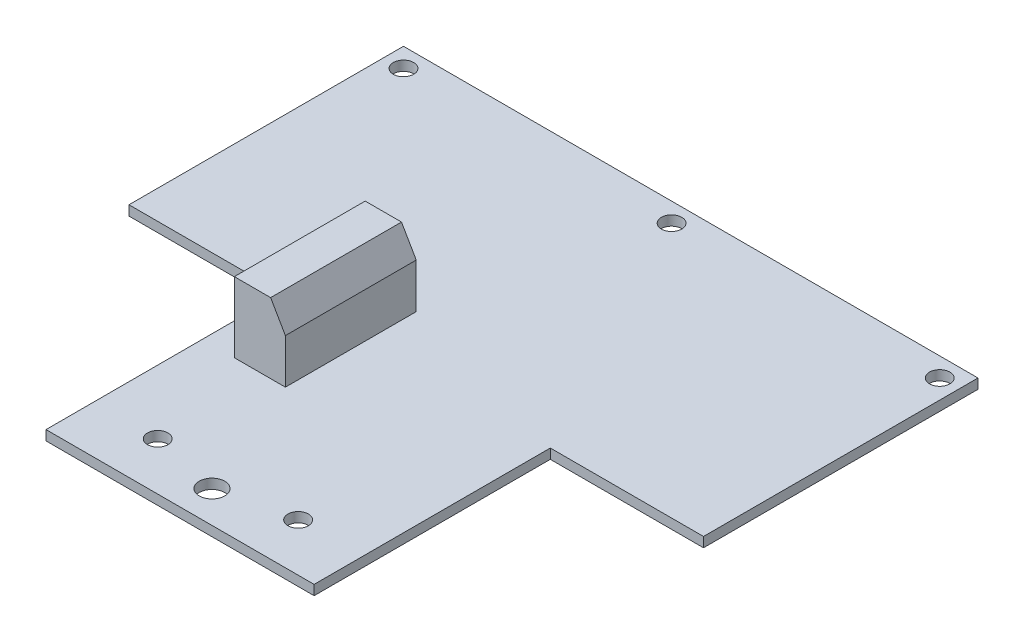
ISO-10303-21;
HEADER;
FILE_DESCRIPTION(('STEP AP214'),'2;1');
FILE_NAME('part.step','',(''),(''),'','','');
FILE_SCHEMA(('AUTOMOTIVE_DESIGN { 1 0 10303 214 1 1 1 1 }'));
ENDSEC;
DATA;
#1=APPLICATION_CONTEXT('core data for automotive mechanical design processes');
#2=APPLICATION_PROTOCOL_DEFINITION('international standard','automotive_design',2000,#1);
#3=PRODUCT_CONTEXT('',#1,'mechanical');
#4=PRODUCT('Part','Part','',(#3));
#5=PRODUCT_RELATED_PRODUCT_CATEGORY('part','',(#4));
#6=PRODUCT_DEFINITION_FORMATION('','',#4);
#7=PRODUCT_DEFINITION_CONTEXT('part definition',#1,'design');
#8=PRODUCT_DEFINITION('design','',#6,#7);
#9=PRODUCT_DEFINITION_SHAPE('','',#8);
#10=(LENGTH_UNIT() NAMED_UNIT(*) SI_UNIT(.MILLI.,.METRE.));
#11=(NAMED_UNIT(*) PLANE_ANGLE_UNIT() SI_UNIT($,.RADIAN.));
#12=(NAMED_UNIT(*) SI_UNIT($,.STERADIAN.) SOLID_ANGLE_UNIT());
#13=UNCERTAINTY_MEASURE_WITH_UNIT(LENGTH_MEASURE(1.E-05),#10,'distance_accuracy_value','');
#14=(GEOMETRIC_REPRESENTATION_CONTEXT(3) GLOBAL_UNCERTAINTY_ASSIGNED_CONTEXT((#13)) GLOBAL_UNIT_ASSIGNED_CONTEXT((#10,
#11,#12)) REPRESENTATION_CONTEXT('',''));
#15=CARTESIAN_POINT('',(0.,0.,0.));
#16=DIRECTION('',(0.,0.,1.));
#17=DIRECTION('',(1.,0.,0.));
#18=AXIS2_PLACEMENT_3D('',#15,#16,#17);
#19=CARTESIAN_POINT('',(0.,1.54,0.));
#20=DIRECTION('',(0.,1.,0.));
#21=DIRECTION('',(0.,0.,1.));
#22=AXIS2_PLACEMENT_3D('',#19,#20,#21);
#23=PLANE('',#22);
#24=CARTESIAN_POINT('',(-11.,1.54,-7.5));
#25=DIRECTION('',(0.,1.,0.));
#26=DIRECTION('',(0.,0.,-1.));
#27=AXIS2_PLACEMENT_3D('',#24,#25,#26);
#28=CIRCLE('',#27,1.6);
#29=CARTESIAN_POINT('',(-11.,1.54,-9.1));
#30=VERTEX_POINT('',#29);
#31=EDGE_CURVE('E157',#30,#30,#28,.T.);
#32=ORIENTED_EDGE('',*,*,#31,.F.);
#33=EDGE_LOOP('',(#32));
#34=FACE_BOUND('',#33,.T.);
#35=CARTESIAN_POINT('',(0.,1.54,-5.));
#36=DIRECTION('',(0.,1.,0.));
#37=DIRECTION('',(0.,0.,1.));
#38=AXIS2_PLACEMENT_3D('',#35,#36,#37);
#39=CIRCLE('',#38,2.);
#40=CARTESIAN_POINT('',(0.,1.54,-3.));
#41=VERTEX_POINT('',#40);
#42=EDGE_CURVE('E172',#41,#41,#39,.T.);
#43=ORIENTED_EDGE('',*,*,#42,.F.);
#44=EDGE_LOOP('',(#43));
#45=FACE_BOUND('',#44,.T.);
#46=CARTESIAN_POINT('',(42.,1.54,-77.));
#47=DIRECTION('',(0.,1.,0.));
#48=DIRECTION('',(0.,0.,1.));
#49=AXIS2_PLACEMENT_3D('',#46,#47,#48);
#50=CIRCLE('',#49,1.6);
#51=CARTESIAN_POINT('',(42.,1.54,-75.4));
#52=VERTEX_POINT('',#51);
#53=EDGE_CURVE('E184',#52,#52,#50,.T.);
#54=ORIENTED_EDGE('',*,*,#53,.F.);
#55=EDGE_LOOP('',(#54));
#56=FACE_BOUND('',#55,.T.);
#57=DIRECTION('',(1.,0.,0.));
#58=VECTOR('',#57,1.);
#59=CARTESIAN_POINT('',(21.,1.54,-37.));
#60=LINE('',#59,#58);
#61=CARTESIAN_POINT('',(21.,1.54,-37.));
#62=VERTEX_POINT('',#61);
#63=CARTESIAN_POINT('',(45.,1.54,-37.));
#64=VERTEX_POINT('',#63);
#65=EDGE_CURVE('E196',#62,#64,#60,.T.);
#66=ORIENTED_EDGE('',*,*,#65,.T.);
#67=DIRECTION('',(0.,0.,-1.));
#68=VECTOR('',#67,1.);
#69=CARTESIAN_POINT('',(45.,1.54,-37.));
#70=LINE('',#69,#68);
#71=CARTESIAN_POINT('',(45.,1.54,-80.));
#72=VERTEX_POINT('',#71);
#73=EDGE_CURVE('E199',#64,#72,#70,.T.);
#74=ORIENTED_EDGE('',*,*,#73,.T.);
#75=DIRECTION('',(-1.,0.,0.));
#76=VECTOR('',#75,1.);
#77=CARTESIAN_POINT('',(45.,1.54,-80.));
#78=LINE('',#77,#76);
#79=CARTESIAN_POINT('',(-45.,1.54,-80.));
#80=VERTEX_POINT('',#79);
#81=EDGE_CURVE('E202',#72,#80,#78,.T.);
#82=ORIENTED_EDGE('',*,*,#81,.T.);
#83=DIRECTION('',(0.,0.,1.));
#84=VECTOR('',#83,1.);
#85=CARTESIAN_POINT('',(-45.,1.54,-37.));
#86=LINE('',#85,#84);
#87=CARTESIAN_POINT('',(-45.,1.54,-37.));
#88=VERTEX_POINT('',#87);
#89=EDGE_CURVE('E204',#80,#88,#86,.T.);
#90=ORIENTED_EDGE('',*,*,#89,.T.);
#91=DIRECTION('',(1.,0.,0.));
#92=VECTOR('',#91,1.);
#93=CARTESIAN_POINT('',(-21.,1.54,-37.));
#94=LINE('',#93,#92);
#95=CARTESIAN_POINT('',(-21.,1.54,-37.));
#96=VERTEX_POINT('',#95);
#97=EDGE_CURVE('E206',#88,#96,#94,.T.);
#98=ORIENTED_EDGE('',*,*,#97,.T.);
#99=DIRECTION('',(0.,0.,1.));
#100=VECTOR('',#99,1.);
#101=CARTESIAN_POINT('',(-21.,1.54,0.));
#102=LINE('',#101,#100);
#103=CARTESIAN_POINT('',(-21.,1.54,0.));
#104=VERTEX_POINT('',#103);
#105=EDGE_CURVE('E208',#96,#104,#102,.T.);
#106=ORIENTED_EDGE('',*,*,#105,.T.);
#107=DIRECTION('',(1.,0.,0.));
#108=VECTOR('',#107,1.);
#109=CARTESIAN_POINT('',(-21.,1.54,0.));
#110=LINE('',#109,#108);
#111=CARTESIAN_POINT('',(21.,1.54,0.));
#112=VERTEX_POINT('',#111);
#113=EDGE_CURVE('E210',#104,#112,#110,.T.);
#114=ORIENTED_EDGE('',*,*,#113,.T.);
#115=DIRECTION('',(0.,0.,-1.));
#116=VECTOR('',#115,1.);
#117=CARTESIAN_POINT('',(21.,1.54,0.));
#118=LINE('',#117,#116);
#119=EDGE_CURVE('E212',#112,#62,#118,.T.);
#120=ORIENTED_EDGE('',*,*,#119,.T.);
#121=EDGE_LOOP('',(#66,#74,#82,#90,#98,#106,#114,#120));
#122=FACE_BOUND('',#121,.T.);
#123=CARTESIAN_POINT('',(11.,1.54,-7.5));
#124=DIRECTION('',(0.,1.,0.));
#125=DIRECTION('',(0.,0.,1.));
#126=AXIS2_PLACEMENT_3D('',#123,#124,#125);
#127=CIRCLE('',#126,1.6);
#128=CARTESIAN_POINT('',(11.,1.54,-5.9));
#129=VERTEX_POINT('',#128);
#130=EDGE_CURVE('E190',#129,#129,#127,.T.);
#131=ORIENTED_EDGE('',*,*,#130,.F.);
#132=EDGE_LOOP('',(#131));
#133=FACE_BOUND('',#132,.T.);
#134=CARTESIAN_POINT('',(0.,1.54,-77.));
#135=DIRECTION('',(0.,1.,0.));
#136=DIRECTION('',(0.,0.,1.));
#137=AXIS2_PLACEMENT_3D('',#134,#135,#136);
#138=CIRCLE('',#137,1.6);
#139=CARTESIAN_POINT('',(0.,1.54,-75.4));
#140=VERTEX_POINT('',#139);
#141=EDGE_CURVE('E178',#140,#140,#138,.T.);
#142=ORIENTED_EDGE('',*,*,#141,.F.);
#143=EDGE_LOOP('',(#142));
#144=FACE_BOUND('',#143,.T.);
#145=CARTESIAN_POINT('',(-42.,1.54,-77.));
#146=DIRECTION('',(0.,1.,0.));
#147=DIRECTION('',(0.,0.,-1.));
#148=AXIS2_PLACEMENT_3D('',#145,#146,#147);
#149=CIRCLE('',#148,1.6);
#150=CARTESIAN_POINT('',(-42.,1.54,-78.6));
#151=VERTEX_POINT('',#150);
#152=EDGE_CURVE('E166',#151,#151,#149,.T.);
#153=ORIENTED_EDGE('',*,*,#152,.F.);
#154=EDGE_LOOP('',(#153));
#155=FACE_BOUND('',#154,.T.);
#156=DIRECTION('',(1.,0.,0.));
#157=VECTOR('',#156,1.);
#158=CARTESIAN_POINT('',(-16.,1.54,-24.5));
#159=LINE('',#158,#157);
#160=CARTESIAN_POINT('',(-16.,1.54,-24.5));
#161=VERTEX_POINT('',#160);
#162=CARTESIAN_POINT('',(-8.,1.54,-24.5));
#163=VERTEX_POINT('',#162);
#164=EDGE_CURVE('E262',#161,#163,#159,.T.);
#165=ORIENTED_EDGE('',*,*,#164,.F.);
#166=DIRECTION('',(0.,0.,1.));
#167=VECTOR('',#166,1.);
#168=CARTESIAN_POINT('',(-16.,1.54,-24.5));
#169=LINE('',#168,#167);
#170=CARTESIAN_POINT('',(-16.,1.54,-45.));
#171=VERTEX_POINT('',#170);
#172=EDGE_CURVE('E151',#171,#161,#169,.T.);
#173=ORIENTED_EDGE('',*,*,#172,.F.);
#174=DIRECTION('',(-1.,0.,0.));
#175=VECTOR('',#174,1.);
#176=CARTESIAN_POINT('',(-16.,1.54,-45.));
#177=LINE('',#176,#175);
#178=CARTESIAN_POINT('',(-8.,1.54,-45.));
#179=VERTEX_POINT('',#178);
#180=EDGE_CURVE('E147',#179,#171,#177,.T.);
#181=ORIENTED_EDGE('',*,*,#180,.F.);
#182=DIRECTION('',(0.,0.,-1.));
#183=VECTOR('',#182,1.);
#184=CARTESIAN_POINT('',(-8.,1.54,-24.5));
#185=LINE('',#184,#183);
#186=EDGE_CURVE('E264',#163,#179,#185,.T.);
#187=ORIENTED_EDGE('',*,*,#186,.F.);
#188=EDGE_LOOP('',(#165,#173,#181,#187));
#189=FACE_BOUND('',#188,.T.);
#190=ADVANCED_FACE('F36',(#34,#45,#56,#122,#133,#144,#155,#189),#23,.T.);
#191=CARTESIAN_POINT('',(0.,0.,0.));
#192=DIRECTION('',(0.,1.,0.));
#193=DIRECTION('',(0.,0.,1.));
#194=AXIS2_PLACEMENT_3D('',#191,#192,#193);
#195=PLANE('',#194);
#196=CARTESIAN_POINT('',(-42.,0.,-77.));
#197=DIRECTION('',(0.,1.,0.));
#198=DIRECTION('',(0.,0.,-1.));
#199=AXIS2_PLACEMENT_3D('',#196,#197,#198);
#200=CIRCLE('',#199,1.6);
#201=CARTESIAN_POINT('',(-42.,0.,-78.6));
#202=VERTEX_POINT('',#201);
#203=EDGE_CURVE('E164',#202,#202,#200,.T.);
#204=ORIENTED_EDGE('',*,*,#203,.T.);
#205=EDGE_LOOP('',(#204));
#206=FACE_BOUND('',#205,.T.);
#207=CARTESIAN_POINT('',(0.,0.,-77.));
#208=DIRECTION('',(0.,1.,0.));
#209=DIRECTION('',(0.,0.,1.));
#210=AXIS2_PLACEMENT_3D('',#207,#208,#209);
#211=CIRCLE('',#210,1.6);
#212=CARTESIAN_POINT('',(0.,0.,-75.4));
#213=VERTEX_POINT('',#212);
#214=EDGE_CURVE('E175',#213,#213,#211,.T.);
#215=ORIENTED_EDGE('',*,*,#214,.T.);
#216=EDGE_LOOP('',(#215));
#217=FACE_BOUND('',#216,.T.);
#218=CARTESIAN_POINT('',(11.,0.,-7.5));
#219=DIRECTION('',(0.,1.,0.));
#220=DIRECTION('',(0.,0.,1.));
#221=AXIS2_PLACEMENT_3D('',#218,#219,#220);
#222=CIRCLE('',#221,1.6);
#223=CARTESIAN_POINT('',(11.,0.,-5.9));
#224=VERTEX_POINT('',#223);
#225=EDGE_CURVE('E187',#224,#224,#222,.T.);
#226=ORIENTED_EDGE('',*,*,#225,.T.);
#227=EDGE_LOOP('',(#226));
#228=FACE_BOUND('',#227,.T.);
#229=DIRECTION('',(1.,0.,0.));
#230=VECTOR('',#229,1.);
#231=CARTESIAN_POINT('',(21.,0.,-37.));
#232=LINE('',#231,#230);
#233=CARTESIAN_POINT('',(21.,0.,-37.));
#234=VERTEX_POINT('',#233);
#235=CARTESIAN_POINT('',(45.,0.,-37.));
#236=VERTEX_POINT('',#235);
#237=EDGE_CURVE('E193',#234,#236,#232,.T.);
#238=ORIENTED_EDGE('',*,*,#237,.F.);
#239=DIRECTION('',(0.,0.,-1.));
#240=VECTOR('',#239,1.);
#241=CARTESIAN_POINT('',(21.,0.,0.));
#242=LINE('',#241,#240);
#243=CARTESIAN_POINT('',(21.,0.,0.));
#244=VERTEX_POINT('',#243);
#245=EDGE_CURVE('E200',#244,#234,#242,.T.);
#246=ORIENTED_EDGE('',*,*,#245,.F.);
#247=DIRECTION('',(1.,0.,0.));
#248=VECTOR('',#247,1.);
#249=CARTESIAN_POINT('',(-21.,0.,0.));
#250=LINE('',#249,#248);
#251=CARTESIAN_POINT('',(-21.,0.,0.));
#252=VERTEX_POINT('',#251);
#253=EDGE_CURVE('E227',#252,#244,#250,.T.);
#254=ORIENTED_EDGE('',*,*,#253,.F.);
#255=DIRECTION('',(0.,0.,1.));
#256=VECTOR('',#255,1.);
#257=CARTESIAN_POINT('',(-21.,0.,0.));
#258=LINE('',#257,#256);
#259=CARTESIAN_POINT('',(-21.,0.,-37.));
#260=VERTEX_POINT('',#259);
#261=EDGE_CURVE('E225',#260,#252,#258,.T.);
#262=ORIENTED_EDGE('',*,*,#261,.F.);
#263=DIRECTION('',(1.,0.,0.));
#264=VECTOR('',#263,1.);
#265=CARTESIAN_POINT('',(-21.,0.,-37.));
#266=LINE('',#265,#264);
#267=CARTESIAN_POINT('',(-45.,0.,-37.));
#268=VERTEX_POINT('',#267);
#269=EDGE_CURVE('E223',#268,#260,#266,.T.);
#270=ORIENTED_EDGE('',*,*,#269,.F.);
#271=DIRECTION('',(0.,0.,1.));
#272=VECTOR('',#271,1.);
#273=CARTESIAN_POINT('',(-45.,0.,-37.));
#274=LINE('',#273,#272);
#275=CARTESIAN_POINT('',(-45.,0.,-80.));
#276=VERTEX_POINT('',#275);
#277=EDGE_CURVE('E221',#276,#268,#274,.T.);
#278=ORIENTED_EDGE('',*,*,#277,.F.);
#279=DIRECTION('',(-1.,0.,0.));
#280=VECTOR('',#279,1.);
#281=CARTESIAN_POINT('',(45.,0.,-80.));
#282=LINE('',#281,#280);
#283=CARTESIAN_POINT('',(45.,0.,-80.));
#284=VERTEX_POINT('',#283);
#285=EDGE_CURVE('E219',#284,#276,#282,.T.);
#286=ORIENTED_EDGE('',*,*,#285,.F.);
#287=DIRECTION('',(0.,0.,-1.));
#288=VECTOR('',#287,1.);
#289=CARTESIAN_POINT('',(45.,0.,-37.));
#290=LINE('',#289,#288);
#291=EDGE_CURVE('E217',#236,#284,#290,.T.);
#292=ORIENTED_EDGE('',*,*,#291,.F.);
#293=EDGE_LOOP('',(#238,#246,#254,#262,#270,#278,#286,#292));
#294=FACE_BOUND('',#293,.T.);
#295=CARTESIAN_POINT('',(42.,0.,-77.));
#296=DIRECTION('',(0.,1.,0.));
#297=DIRECTION('',(0.,0.,1.));
#298=AXIS2_PLACEMENT_3D('',#295,#296,#297);
#299=CIRCLE('',#298,1.6);
#300=CARTESIAN_POINT('',(42.,0.,-75.4));
#301=VERTEX_POINT('',#300);
#302=EDGE_CURVE('E181',#301,#301,#299,.T.);
#303=ORIENTED_EDGE('',*,*,#302,.T.);
#304=EDGE_LOOP('',(#303));
#305=FACE_BOUND('',#304,.T.);
#306=CARTESIAN_POINT('',(0.,0.,-5.));
#307=DIRECTION('',(0.,1.,0.));
#308=DIRECTION('',(0.,0.,1.));
#309=AXIS2_PLACEMENT_3D('',#306,#307,#308);
#310=CIRCLE('',#309,2.);
#311=CARTESIAN_POINT('',(0.,0.,-3.));
#312=VERTEX_POINT('',#311);
#313=EDGE_CURVE('E169',#312,#312,#310,.T.);
#314=ORIENTED_EDGE('',*,*,#313,.T.);
#315=EDGE_LOOP('',(#314));
#316=FACE_BOUND('',#315,.T.);
#317=CARTESIAN_POINT('',(-11.,0.,-7.5));
#318=DIRECTION('',(0.,1.,0.));
#319=DIRECTION('',(0.,0.,-1.));
#320=AXIS2_PLACEMENT_3D('',#317,#318,#319);
#321=CIRCLE('',#320,1.6);
#322=CARTESIAN_POINT('',(-11.,0.,-9.1));
#323=VERTEX_POINT('',#322);
#324=EDGE_CURVE('E153',#323,#323,#321,.T.);
#325=ORIENTED_EDGE('',*,*,#324,.T.);
#326=EDGE_LOOP('',(#325));
#327=FACE_BOUND('',#326,.T.);
#328=ADVANCED_FACE('F277',(#206,#217,#228,#294,#305,#316,#327),#195,.F.);
#329=CARTESIAN_POINT('',(21.,1.54,-37.));
#330=DIRECTION('',(0.,0.,-1.));
#331=DIRECTION('',(-1.,0.,0.));
#332=AXIS2_PLACEMENT_3D('',#329,#330,#331);
#333=PLANE('',#332);
#334=ORIENTED_EDGE('',*,*,#237,.T.);
#335=DIRECTION('',(0.,-1.,0.));
#336=VECTOR('',#335,1.);
#337=CARTESIAN_POINT('',(45.,1.54,-37.));
#338=LINE('',#337,#336);
#339=EDGE_CURVE('E250',#64,#236,#338,.T.);
#340=ORIENTED_EDGE('',*,*,#339,.F.);
#341=ORIENTED_EDGE('',*,*,#65,.F.);
#342=DIRECTION('',(0.,-1.,0.));
#343=VECTOR('',#342,1.);
#344=CARTESIAN_POINT('',(21.,1.54,-37.));
#345=LINE('',#344,#343);
#346=EDGE_CURVE('E214',#62,#234,#345,.T.);
#347=ORIENTED_EDGE('',*,*,#346,.T.);
#348=EDGE_LOOP('',(#334,#340,#341,#347));
#349=FACE_BOUND('',#348,.T.);
#350=ADVANCED_FACE('F283',(#349),#333,.F.);
#351=CARTESIAN_POINT('',(45.,1.54,-37.));
#352=DIRECTION('',(-1.,0.,0.));
#353=DIRECTION('',(0.,0.,1.));
#354=AXIS2_PLACEMENT_3D('',#351,#352,#353);
#355=PLANE('',#354);
#356=ORIENTED_EDGE('',*,*,#291,.T.);
#357=DIRECTION('',(0.,-1.,0.));
#358=VECTOR('',#357,1.);
#359=CARTESIAN_POINT('',(45.,1.54,-80.));
#360=LINE('',#359,#358);
#361=EDGE_CURVE('E247',#72,#284,#360,.T.);
#362=ORIENTED_EDGE('',*,*,#361,.F.);
#363=ORIENTED_EDGE('',*,*,#73,.F.);
#364=ORIENTED_EDGE('',*,*,#339,.T.);
#365=EDGE_LOOP('',(#356,#362,#363,#364));
#366=FACE_BOUND('',#365,.T.);
#367=ADVANCED_FACE('F315',(#366),#355,.F.);
#368=CARTESIAN_POINT('',(45.,1.54,-80.));
#369=DIRECTION('',(0.,0.,1.));
#370=DIRECTION('',(1.,0.,0.));
#371=AXIS2_PLACEMENT_3D('',#368,#369,#370);
#372=PLANE('',#371);
#373=ORIENTED_EDGE('',*,*,#285,.T.);
#374=DIRECTION('',(0.,-1.,0.));
#375=VECTOR('',#374,1.);
#376=CARTESIAN_POINT('',(-45.,1.54,-80.));
#377=LINE('',#376,#375);
#378=EDGE_CURVE('E244',#80,#276,#377,.T.);
#379=ORIENTED_EDGE('',*,*,#378,.F.);
#380=ORIENTED_EDGE('',*,*,#81,.F.);
#381=ORIENTED_EDGE('',*,*,#361,.T.);
#382=EDGE_LOOP('',(#373,#379,#380,#381));
#383=FACE_BOUND('',#382,.T.);
#384=ADVANCED_FACE('F311',(#383),#372,.F.);
#385=CARTESIAN_POINT('',(-45.,1.54,-37.));
#386=DIRECTION('',(1.,0.,0.));
#387=DIRECTION('',(0.,0.,-1.));
#388=AXIS2_PLACEMENT_3D('',#385,#386,#387);
#389=PLANE('',#388);
#390=ORIENTED_EDGE('',*,*,#277,.T.);
#391=DIRECTION('',(0.,-1.,0.));
#392=VECTOR('',#391,1.);
#393=CARTESIAN_POINT('',(-45.,1.54,-37.));
#394=LINE('',#393,#392);
#395=EDGE_CURVE('E241',#88,#268,#394,.T.);
#396=ORIENTED_EDGE('',*,*,#395,.F.);
#397=ORIENTED_EDGE('',*,*,#89,.F.);
#398=ORIENTED_EDGE('',*,*,#378,.T.);
#399=EDGE_LOOP('',(#390,#396,#397,#398));
#400=FACE_BOUND('',#399,.T.);
#401=ADVANCED_FACE('F307',(#400),#389,.F.);
#402=CARTESIAN_POINT('',(-21.,1.54,-37.));
#403=DIRECTION('',(0.,0.,-1.));
#404=DIRECTION('',(-1.,0.,0.));
#405=AXIS2_PLACEMENT_3D('',#402,#403,#404);
#406=PLANE('',#405);
#407=ORIENTED_EDGE('',*,*,#269,.T.);
#408=DIRECTION('',(0.,-1.,0.));
#409=VECTOR('',#408,1.);
#410=CARTESIAN_POINT('',(-21.,1.54,-37.));
#411=LINE('',#410,#409);
#412=EDGE_CURVE('E238',#96,#260,#411,.T.);
#413=ORIENTED_EDGE('',*,*,#412,.F.);
#414=ORIENTED_EDGE('',*,*,#97,.F.);
#415=ORIENTED_EDGE('',*,*,#395,.T.);
#416=EDGE_LOOP('',(#407,#413,#414,#415));
#417=FACE_BOUND('',#416,.T.);
#418=ADVANCED_FACE('F303',(#417),#406,.F.);
#419=CARTESIAN_POINT('',(-21.,1.54,0.));
#420=DIRECTION('',(1.,0.,0.));
#421=DIRECTION('',(0.,0.,-1.));
#422=AXIS2_PLACEMENT_3D('',#419,#420,#421);
#423=PLANE('',#422);
#424=ORIENTED_EDGE('',*,*,#261,.T.);
#425=DIRECTION('',(0.,-1.,0.));
#426=VECTOR('',#425,1.);
#427=CARTESIAN_POINT('',(-21.,1.54,0.));
#428=LINE('',#427,#426);
#429=EDGE_CURVE('E235',#104,#252,#428,.T.);
#430=ORIENTED_EDGE('',*,*,#429,.F.);
#431=ORIENTED_EDGE('',*,*,#105,.F.);
#432=ORIENTED_EDGE('',*,*,#412,.T.);
#433=EDGE_LOOP('',(#424,#430,#431,#432));
#434=FACE_BOUND('',#433,.T.);
#435=ADVANCED_FACE('F299',(#434),#423,.F.);
#436=CARTESIAN_POINT('',(-21.,1.54,0.));
#437=DIRECTION('',(0.,0.,-1.));
#438=DIRECTION('',(-1.,0.,0.));
#439=AXIS2_PLACEMENT_3D('',#436,#437,#438);
#440=PLANE('',#439);
#441=ORIENTED_EDGE('',*,*,#253,.T.);
#442=DIRECTION('',(0.,-1.,0.));
#443=VECTOR('',#442,1.);
#444=CARTESIAN_POINT('',(21.,1.54,0.));
#445=LINE('',#444,#443);
#446=EDGE_CURVE('E232',#112,#244,#445,.T.);
#447=ORIENTED_EDGE('',*,*,#446,.F.);
#448=ORIENTED_EDGE('',*,*,#113,.F.);
#449=ORIENTED_EDGE('',*,*,#429,.T.);
#450=EDGE_LOOP('',(#441,#447,#448,#449));
#451=FACE_BOUND('',#450,.T.);
#452=ADVANCED_FACE('F295',(#451),#440,.F.);
#453=CARTESIAN_POINT('',(21.,1.54,0.));
#454=DIRECTION('',(-1.,0.,0.));
#455=DIRECTION('',(0.,0.,1.));
#456=AXIS2_PLACEMENT_3D('',#453,#454,#455);
#457=PLANE('',#456);
#458=ORIENTED_EDGE('',*,*,#245,.T.);
#459=ORIENTED_EDGE('',*,*,#346,.F.);
#460=ORIENTED_EDGE('',*,*,#119,.F.);
#461=ORIENTED_EDGE('',*,*,#446,.T.);
#462=EDGE_LOOP('',(#458,#459,#460,#461));
#463=FACE_BOUND('',#462,.T.);
#464=ADVANCED_FACE('F292',(#463),#457,.F.);
#465=CARTESIAN_POINT('',(11.,1.54,-7.5));
#466=DIRECTION('',(0.,-1.,0.));
#467=DIRECTION('',(0.,0.,-1.));
#468=AXIS2_PLACEMENT_3D('',#465,#466,#467);
#469=CYLINDRICAL_SURFACE('',#468,1.6);
#470=ORIENTED_EDGE('',*,*,#130,.T.);
#471=EDGE_LOOP('',(#470));
#472=FACE_BOUND('',#471,.T.);
#473=ORIENTED_EDGE('',*,*,#225,.F.);
#474=EDGE_LOOP('',(#473));
#475=FACE_BOUND('',#474,.T.);
#476=ADVANCED_FACE('F289',(#472,#475),#469,.F.);
#477=CARTESIAN_POINT('',(42.,1.54,-77.));
#478=DIRECTION('',(0.,-1.,0.));
#479=DIRECTION('',(0.,0.,-1.));
#480=AXIS2_PLACEMENT_3D('',#477,#478,#479);
#481=CYLINDRICAL_SURFACE('',#480,1.6);
#482=ORIENTED_EDGE('',*,*,#53,.T.);
#483=EDGE_LOOP('',(#482));
#484=FACE_BOUND('',#483,.T.);
#485=ORIENTED_EDGE('',*,*,#302,.F.);
#486=EDGE_LOOP('',(#485));
#487=FACE_BOUND('',#486,.T.);
#488=ADVANCED_FACE('F368',(#484,#487),#481,.F.);
#489=CARTESIAN_POINT('',(0.,1.54,-77.));
#490=DIRECTION('',(0.,-1.,0.));
#491=DIRECTION('',(0.,0.,-1.));
#492=AXIS2_PLACEMENT_3D('',#489,#490,#491);
#493=CYLINDRICAL_SURFACE('',#492,1.6);
#494=ORIENTED_EDGE('',*,*,#141,.T.);
#495=EDGE_LOOP('',(#494));
#496=FACE_BOUND('',#495,.T.);
#497=ORIENTED_EDGE('',*,*,#214,.F.);
#498=EDGE_LOOP('',(#497));
#499=FACE_BOUND('',#498,.T.);
#500=ADVANCED_FACE('F373',(#496,#499),#493,.F.);
#501=CARTESIAN_POINT('',(0.,1.54,-5.));
#502=DIRECTION('',(0.,-1.,0.));
#503=DIRECTION('',(0.,0.,-1.));
#504=AXIS2_PLACEMENT_3D('',#501,#502,#503);
#505=CYLINDRICAL_SURFACE('',#504,2.);
#506=ORIENTED_EDGE('',*,*,#42,.T.);
#507=EDGE_LOOP('',(#506));
#508=FACE_BOUND('',#507,.T.);
#509=ORIENTED_EDGE('',*,*,#313,.F.);
#510=EDGE_LOOP('',(#509));
#511=FACE_BOUND('',#510,.T.);
#512=ADVANCED_FACE('F359',(#508,#511),#505,.F.);
#513=CARTESIAN_POINT('',(-42.,1.54,-77.));
#514=DIRECTION('',(0.,-1.,0.));
#515=DIRECTION('',(0.,0.,-1.));
#516=AXIS2_PLACEMENT_3D('',#513,#514,#515);
#517=CYLINDRICAL_SURFACE('',#516,1.6);
#518=ORIENTED_EDGE('',*,*,#152,.T.);
#519=EDGE_LOOP('',(#518));
#520=FACE_BOUND('',#519,.T.);
#521=ORIENTED_EDGE('',*,*,#203,.F.);
#522=EDGE_LOOP('',(#521));
#523=FACE_BOUND('',#522,.T.);
#524=ADVANCED_FACE('F355',(#520,#523),#517,.F.);
#525=CARTESIAN_POINT('',(-11.,1.54,-7.5));
#526=DIRECTION('',(0.,-1.,0.));
#527=DIRECTION('',(0.,0.,-1.));
#528=AXIS2_PLACEMENT_3D('',#525,#526,#527);
#529=CYLINDRICAL_SURFACE('',#528,1.6);
#530=ORIENTED_EDGE('',*,*,#31,.T.);
#531=EDGE_LOOP('',(#530));
#532=FACE_BOUND('',#531,.T.);
#533=ORIENTED_EDGE('',*,*,#324,.F.);
#534=EDGE_LOOP('',(#533));
#535=FACE_BOUND('',#534,.T.);
#536=ADVANCED_FACE('F358',(#532,#535),#529,.F.);
#537=CARTESIAN_POINT('',(-16.,12.54,-24.5));
#538=DIRECTION('',(1.,0.,0.));
#539=DIRECTION('',(0.,0.,-1.));
#540=AXIS2_PLACEMENT_3D('',#537,#538,#539);
#541=PLANE('',#540);
#542=ORIENTED_EDGE('',*,*,#172,.T.);
#543=DIRECTION('',(0.,-1.,0.));
#544=VECTOR('',#543,1.);
#545=CARTESIAN_POINT('',(-16.,12.54,-24.5));
#546=LINE('',#545,#544);
#547=CARTESIAN_POINT('',(-16.,12.54,-24.5));
#548=VERTEX_POINT('',#547);
#549=EDGE_CURVE('E133',#548,#161,#546,.T.);
#550=ORIENTED_EDGE('',*,*,#549,.F.);
#551=DIRECTION('',(0.,0.,1.));
#552=VECTOR('',#551,1.);
#553=CARTESIAN_POINT('',(-16.,12.54,-24.5));
#554=LINE('',#553,#552);
#555=CARTESIAN_POINT('',(-16.,12.54,-45.));
#556=VERTEX_POINT('',#555);
#557=EDGE_CURVE('E140',#556,#548,#554,.T.);
#558=ORIENTED_EDGE('',*,*,#557,.F.);
#559=DIRECTION('',(0.,-1.,0.));
#560=VECTOR('',#559,1.);
#561=CARTESIAN_POINT('',(-16.,12.54,-45.));
#562=LINE('',#561,#560);
#563=EDGE_CURVE('E257',#556,#171,#562,.T.);
#564=ORIENTED_EDGE('',*,*,#563,.T.);
#565=EDGE_LOOP('',(#542,#550,#558,#564));
#566=FACE_BOUND('',#565,.T.);
#567=ADVANCED_FACE('F149',(#566),#541,.F.);
#568=CARTESIAN_POINT('',(-16.,12.54,-24.5));
#569=DIRECTION('',(0.,0.,-1.));
#570=DIRECTION('',(-1.,0.,0.));
#571=AXIS2_PLACEMENT_3D('',#568,#569,#570);
#572=PLANE('',#571);
#573=DIRECTION('',(0.,-1.,0.));
#574=VECTOR('',#573,1.);
#575=CARTESIAN_POINT('',(-8.,12.54,-24.5));
#576=LINE('',#575,#574);
#577=CARTESIAN_POINT('',(-8.,8.53999999999997,-24.5));
#578=VERTEX_POINT('',#577);
#579=EDGE_CURVE('E154',#578,#163,#576,.T.);
#580=ORIENTED_EDGE('',*,*,#579,.F.);
#581=DIRECTION('',(0.499999999999999,-0.86602540378444,0.));
#582=VECTOR('',#581,1.);
#583=CARTESIAN_POINT('',(-10.3094010767585,12.54,-24.5));
#584=LINE('',#583,#582);
#585=CARTESIAN_POINT('',(-10.3094010767585,12.54,-24.5));
#586=VERTEX_POINT('',#585);
#587=EDGE_CURVE('E11',#578,#586,#584,.F.);
#588=ORIENTED_EDGE('',*,*,#587,.T.);
#589=DIRECTION('',(1.,0.,0.));
#590=VECTOR('',#589,1.);
#591=CARTESIAN_POINT('',(-16.,12.54,-24.5));
#592=LINE('',#591,#590);
#593=EDGE_CURVE('E128',#548,#586,#592,.T.);
#594=ORIENTED_EDGE('',*,*,#593,.F.);
#595=ORIENTED_EDGE('',*,*,#549,.T.);
#596=ORIENTED_EDGE('',*,*,#164,.T.);
#597=EDGE_LOOP('',(#580,#588,#594,#595,#596));
#598=FACE_BOUND('',#597,.T.);
#599=ADVANCED_FACE('F130',(#598),#572,.F.);
#600=CARTESIAN_POINT('',(-8.,12.54,-24.5));
#601=DIRECTION('',(-1.,0.,0.));
#602=DIRECTION('',(0.,0.,1.));
#603=AXIS2_PLACEMENT_3D('',#600,#601,#602);
#604=PLANE('',#603);
#605=DIRECTION('',(0.,-1.,0.));
#606=VECTOR('',#605,1.);
#607=CARTESIAN_POINT('',(-8.,12.54,-45.));
#608=LINE('',#607,#606);
#609=CARTESIAN_POINT('',(-8.,8.53999999999997,-45.));
#610=VERTEX_POINT('',#609);
#611=EDGE_CURVE('E159',#610,#179,#608,.T.);
#612=ORIENTED_EDGE('',*,*,#611,.F.);
#613=DIRECTION('',(0.,0.,1.));
#614=VECTOR('',#613,1.);
#615=CARTESIAN_POINT('',(-8.,8.53999999999997,-24.5));
#616=LINE('',#615,#614);
#617=EDGE_CURVE('E44',#610,#578,#616,.T.);
#618=ORIENTED_EDGE('',*,*,#617,.T.);
#619=ORIENTED_EDGE('',*,*,#579,.T.);
#620=ORIENTED_EDGE('',*,*,#186,.T.);
#621=EDGE_LOOP('',(#612,#618,#619,#620));
#622=FACE_BOUND('',#621,.T.);
#623=ADVANCED_FACE('F269',(#622),#604,.F.);
#624=CARTESIAN_POINT('',(-16.,12.54,-45.));
#625=DIRECTION('',(0.,0.,1.));
#626=DIRECTION('',(1.,0.,0.));
#627=AXIS2_PLACEMENT_3D('',#624,#625,#626);
#628=PLANE('',#627);
#629=DIRECTION('',(-1.,0.,0.));
#630=VECTOR('',#629,1.);
#631=CARTESIAN_POINT('',(-16.,12.54,-45.));
#632=LINE('',#631,#630);
#633=CARTESIAN_POINT('',(-10.3094010767585,12.54,-45.));
#634=VERTEX_POINT('',#633);
#635=EDGE_CURVE('E139',#634,#556,#632,.T.);
#636=ORIENTED_EDGE('',*,*,#635,.F.);
#637=DIRECTION('',(-0.499999999999999,0.86602540378444,0.));
#638=VECTOR('',#637,1.);
#639=CARTESIAN_POINT('',(-10.3094010767585,12.54,-45.));
#640=LINE('',#639,#638);
#641=EDGE_CURVE('E58',#634,#610,#640,.F.);
#642=ORIENTED_EDGE('',*,*,#641,.T.);
#643=ORIENTED_EDGE('',*,*,#611,.T.);
#644=ORIENTED_EDGE('',*,*,#180,.T.);
#645=ORIENTED_EDGE('',*,*,#563,.F.);
#646=EDGE_LOOP('',(#636,#642,#643,#644,#645));
#647=FACE_BOUND('',#646,.T.);
#648=ADVANCED_FACE('F256',(#647),#628,.F.);
#649=CARTESIAN_POINT('',(0.,12.54,0.));
#650=DIRECTION('',(0.,-1.,0.));
#651=DIRECTION('',(0.,0.,-1.));
#652=AXIS2_PLACEMENT_3D('',#649,#650,#651);
#653=PLANE('',#652);
#654=ORIENTED_EDGE('',*,*,#593,.T.);
#655=DIRECTION('',(0.,0.,-1.));
#656=VECTOR('',#655,1.);
#657=CARTESIAN_POINT('',(-10.3094010767585,12.54,0.));
#658=LINE('',#657,#656);
#659=EDGE_CURVE('E253',#586,#634,#658,.T.);
#660=ORIENTED_EDGE('',*,*,#659,.T.);
#661=ORIENTED_EDGE('',*,*,#635,.T.);
#662=ORIENTED_EDGE('',*,*,#557,.T.);
#663=EDGE_LOOP('',(#654,#660,#661,#662));
#664=FACE_BOUND('',#663,.T.);
#665=ADVANCED_FACE('F143',(#664),#653,.F.);
#666=CARTESIAN_POINT('',(-10.3094010767585,12.54,0.));
#667=DIRECTION('',(-0.86602540378444,-0.499999999999999,0.));
#668=DIRECTION('',(0.,0.,-1.));
#669=AXIS2_PLACEMENT_3D('',#666,#667,#668);
#670=PLANE('',#669);
#671=ORIENTED_EDGE('',*,*,#587,.F.);
#672=ORIENTED_EDGE('',*,*,#617,.F.);
#673=ORIENTED_EDGE('',*,*,#641,.F.);
#674=ORIENTED_EDGE('',*,*,#659,.F.);
#675=EDGE_LOOP('',(#671,#672,#673,#674));
#676=FACE_BOUND('',#675,.T.);
#677=ADVANCED_FACE('F38',(#676),#670,.F.);
#678=CLOSED_SHELL('',(#190,#328,#350,#367,#384,#401,#418,#435,#452,#464,#476,#488,#500,#512,
#524,#536,#567,#599,#623,#648,#665,#677));
#679=MANIFOLD_SOLID_BREP('B2',#678);
#680=ADVANCED_BREP_SHAPE_REPRESENTATION('',(#18,#679),#14);
#681=SHAPE_DEFINITION_REPRESENTATION(#9,#680);
ENDSEC;
END-ISO-10303-21;
